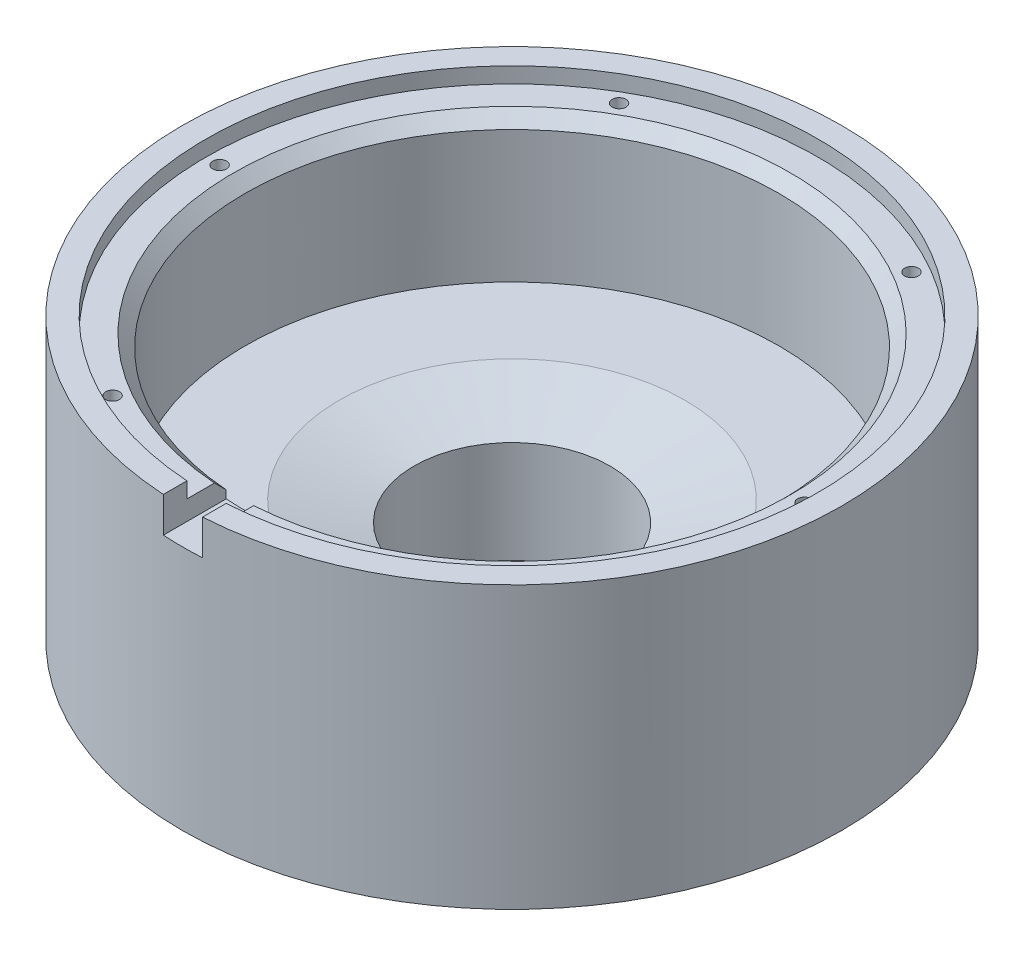
ISO-10303-21;
HEADER;
FILE_DESCRIPTION(('STEP AP214'),'2;1');
FILE_NAME('part.step','',(''),(''),'','','');
FILE_SCHEMA(('AUTOMOTIVE_DESIGN { 1 0 10303 214 1 1 1 1 }'));
ENDSEC;
DATA;
#1=APPLICATION_CONTEXT('core data for automotive mechanical design processes');
#2=APPLICATION_PROTOCOL_DEFINITION('international standard','automotive_design',2000,#1);
#3=PRODUCT_CONTEXT('',#1,'mechanical');
#4=PRODUCT('Part','Part','',(#3));
#5=PRODUCT_RELATED_PRODUCT_CATEGORY('part','',(#4));
#6=PRODUCT_DEFINITION_FORMATION('','',#4);
#7=PRODUCT_DEFINITION_CONTEXT('part definition',#1,'design');
#8=PRODUCT_DEFINITION('design','',#6,#7);
#9=PRODUCT_DEFINITION_SHAPE('','',#8);
#10=(LENGTH_UNIT() NAMED_UNIT(*) SI_UNIT(.MILLI.,.METRE.));
#11=(NAMED_UNIT(*) PLANE_ANGLE_UNIT() SI_UNIT($,.RADIAN.));
#12=(NAMED_UNIT(*) SI_UNIT($,.STERADIAN.) SOLID_ANGLE_UNIT());
#13=UNCERTAINTY_MEASURE_WITH_UNIT(LENGTH_MEASURE(1.E-05),#10,'distance_accuracy_value','');
#14=(GEOMETRIC_REPRESENTATION_CONTEXT(3) GLOBAL_UNCERTAINTY_ASSIGNED_CONTEXT((#13)) GLOBAL_UNIT_ASSIGNED_CONTEXT((#10,
#11,#12)) REPRESENTATION_CONTEXT('',''));
#15=CARTESIAN_POINT('',(0.,0.,0.));
#16=DIRECTION('',(0.,0.,1.));
#17=DIRECTION('',(1.,0.,0.));
#18=AXIS2_PLACEMENT_3D('',#15,#16,#17);
#19=CARTESIAN_POINT('',(0.,-30.2318711174091,0.));
#20=DIRECTION('',(0.,-1.,0.));
#21=DIRECTION('',(0.,0.,-1.));
#22=AXIS2_PLACEMENT_3D('',#19,#20,#21);
#23=CYLINDRICAL_SURFACE('',#22,42.0375);
#24=CARTESIAN_POINT('',(0.,-14.25,0.));
#25=DIRECTION('',(0.,-1.,0.));
#26=DIRECTION('',(0.,0.,-1.));
#27=AXIS2_PLACEMENT_3D('',#24,#25,#26);
#28=CIRCLE('',#27,42.0375);
#29=CARTESIAN_POINT('',(0.,-14.25,-42.0375));
#30=VERTEX_POINT('',#29);
#31=EDGE_CURVE('E181',#30,#30,#28,.T.);
#32=ORIENTED_EDGE('',*,*,#31,.F.);
#33=EDGE_LOOP('',(#32));
#34=FACE_BOUND('',#33,.T.);
#35=CARTESIAN_POINT('',(0.,21.59,0.));
#36=DIRECTION('',(0.,-1.,0.));
#37=DIRECTION('',(0.,0.,-1.));
#38=AXIS2_PLACEMENT_3D('',#35,#36,#37);
#39=CIRCLE('',#38,42.0375);
#40=CARTESIAN_POINT('',(-2.5,21.59,41.9630957658035));
#41=VERTEX_POINT('',#40);
#42=CARTESIAN_POINT('',(2.50000000000001,21.59,41.9630957658035));
#43=VERTEX_POINT('',#42);
#44=EDGE_CURVE('E123',#41,#43,#39,.T.);
#45=ORIENTED_EDGE('',*,*,#44,.T.);
#46=DIRECTION('',(0.,-1.,0.));
#47=VECTOR('',#46,1.);
#48=CARTESIAN_POINT('',(2.50000000000001,-30.2318711174091,41.9630957658035));
#49=LINE('',#48,#47);
#50=CARTESIAN_POINT('',(2.50000000000001,17.09,41.9630957658035));
#51=VERTEX_POINT('',#50);
#52=EDGE_CURVE('E184',#43,#51,#49,.T.);
#53=ORIENTED_EDGE('',*,*,#52,.T.);
#54=CARTESIAN_POINT('',(0.,17.09,0.));
#55=DIRECTION('',(0.,-1.,0.));
#56=DIRECTION('',(0.,0.,-1.));
#57=AXIS2_PLACEMENT_3D('',#54,#55,#56);
#58=CIRCLE('',#57,42.0375);
#59=CARTESIAN_POINT('',(-2.5,17.09,41.9630957658035));
#60=VERTEX_POINT('',#59);
#61=EDGE_CURVE('E112',#51,#60,#58,.T.);
#62=ORIENTED_EDGE('',*,*,#61,.T.);
#63=DIRECTION('',(0.,-1.,0.));
#64=VECTOR('',#63,1.);
#65=CARTESIAN_POINT('',(-2.5,-30.2318711174091,41.9630957658035));
#66=LINE('',#65,#64);
#67=EDGE_CURVE('E186',#60,#41,#66,.F.);
#68=ORIENTED_EDGE('',*,*,#67,.T.);
#69=EDGE_LOOP('',(#45,#53,#62,#68));
#70=FACE_BOUND('',#69,.T.);
#71=ADVANCED_FACE('F41',(#34,#70),#23,.T.);
#72=CARTESIAN_POINT('',(-42.0375,21.59,0.));
#73=DIRECTION('',(0.,-1.,0.));
#74=DIRECTION('',(0.,0.,-1.));
#75=AXIS2_PLACEMENT_3D('',#72,#73,#74);
#76=PLANE('',#75);
#77=CARTESIAN_POINT('',(0.,21.59,0.));
#78=DIRECTION('',(0.,-1.,0.));
#79=DIRECTION('',(0.,0.,-1.));
#80=AXIS2_PLACEMENT_3D('',#77,#78,#79);
#81=CIRCLE('',#80,39.0375);
#82=CARTESIAN_POINT('',(-2.5,21.59,38.9573665209803));
#83=VERTEX_POINT('',#82);
#84=CARTESIAN_POINT('',(2.5,21.59,38.9573665209803));
#85=VERTEX_POINT('',#84);
#86=EDGE_CURVE('E128',#83,#85,#81,.T.);
#87=ORIENTED_EDGE('',*,*,#86,.T.);
#88=DIRECTION('',(0.,0.,-1.));
#89=VECTOR('',#88,1.);
#90=CARTESIAN_POINT('',(2.50000000000001,21.59,42.0375));
#91=LINE('',#90,#89);
#92=EDGE_CURVE('E115',#43,#85,#91,.T.);
#93=ORIENTED_EDGE('',*,*,#92,.F.);
#94=ORIENTED_EDGE('',*,*,#44,.F.);
#95=DIRECTION('',(0.,0.,1.));
#96=VECTOR('',#95,1.);
#97=CARTESIAN_POINT('',(-2.5,21.59,42.0375));
#98=LINE('',#97,#96);
#99=EDGE_CURVE('E190',#83,#41,#98,.T.);
#100=ORIENTED_EDGE('',*,*,#99,.F.);
#101=EDGE_LOOP('',(#87,#93,#94,#100));
#102=FACE_BOUND('',#101,.T.);
#103=ADVANCED_FACE('F170',(#102),#76,.F.);
#104=CARTESIAN_POINT('',(0.,-30.2318711174091,0.));
#105=DIRECTION('',(0.,-1.,0.));
#106=DIRECTION('',(0.,0.,-1.));
#107=AXIS2_PLACEMENT_3D('',#104,#105,#106);
#108=CYLINDRICAL_SURFACE('',#107,39.0375);
#109=CARTESIAN_POINT('',(0.,19.59,0.));
#110=DIRECTION('',(0.,-1.,0.));
#111=DIRECTION('',(0.,0.,-1.));
#112=AXIS2_PLACEMENT_3D('',#109,#110,#111);
#113=CIRCLE('',#112,39.0375);
#114=CARTESIAN_POINT('',(-2.5,19.59,38.9573665209803));
#115=VERTEX_POINT('',#114);
#116=CARTESIAN_POINT('',(2.5,19.59,38.9573665209803));
#117=VERTEX_POINT('',#116);
#118=EDGE_CURVE('E230',#115,#117,#113,.T.);
#119=ORIENTED_EDGE('',*,*,#118,.T.);
#120=DIRECTION('',(0.,-1.,0.));
#121=VECTOR('',#120,1.);
#122=CARTESIAN_POINT('',(2.5,-30.2318711174091,38.9573665209803));
#123=LINE('',#122,#121);
#124=EDGE_CURVE('E213',#117,#85,#123,.F.);
#125=ORIENTED_EDGE('',*,*,#124,.T.);
#126=ORIENTED_EDGE('',*,*,#86,.F.);
#127=DIRECTION('',(0.,-1.,0.));
#128=VECTOR('',#127,1.);
#129=CARTESIAN_POINT('',(-2.5,-30.2318711174091,38.9573665209803));
#130=LINE('',#129,#128);
#131=EDGE_CURVE('E207',#83,#115,#130,.T.);
#132=ORIENTED_EDGE('',*,*,#131,.T.);
#133=EDGE_LOOP('',(#119,#125,#126,#132));
#134=FACE_BOUND('',#133,.T.);
#135=ADVANCED_FACE('F166',(#134),#108,.F.);
#136=CARTESIAN_POINT('',(-39.0375,19.59,0.));
#137=DIRECTION('',(0.,-1.,0.));
#138=DIRECTION('',(0.,0.,-1.));
#139=AXIS2_PLACEMENT_3D('',#136,#137,#138);
#140=PLANE('',#139);
#141=CARTESIAN_POINT('',(-37.2875,19.59,0.));
#142=DIRECTION('',(0.,1.,0.));
#143=DIRECTION('',(0.,0.,1.));
#144=AXIS2_PLACEMENT_3D('',#141,#142,#143);
#145=CIRCLE('',#144,0.874999999999998);
#146=CARTESIAN_POINT('',(-37.2875,19.59,0.874999999999996));
#147=VERTEX_POINT('',#146);
#148=EDGE_CURVE('E302',#147,#147,#145,.T.);
#149=ORIENTED_EDGE('',*,*,#148,.F.);
#150=EDGE_LOOP('',(#149));
#151=FACE_BOUND('',#150,.T.);
#152=CARTESIAN_POINT('',(-18.64375,19.59,32.2919222436123));
#153=DIRECTION('',(0.,1.,0.));
#154=DIRECTION('',(0.,0.,1.));
#155=AXIS2_PLACEMENT_3D('',#152,#153,#154);
#156=CIRCLE('',#155,0.875000000000002);
#157=CARTESIAN_POINT('',(-18.64375,19.59,33.1669222436123));
#158=VERTEX_POINT('',#157);
#159=EDGE_CURVE('E290',#158,#158,#156,.T.);
#160=ORIENTED_EDGE('',*,*,#159,.F.);
#161=EDGE_LOOP('',(#160));
#162=FACE_BOUND('',#161,.T.);
#163=CARTESIAN_POINT('',(18.64375,19.59,32.2919222436122));
#164=DIRECTION('',(0.,1.,0.));
#165=DIRECTION('',(0.,0.,1.));
#166=AXIS2_PLACEMENT_3D('',#163,#164,#165);
#167=CIRCLE('',#166,0.875000000000002);
#168=CARTESIAN_POINT('',(18.64375,19.59,33.1669222436122));
#169=VERTEX_POINT('',#168);
#170=EDGE_CURVE('E289',#169,#169,#167,.T.);
#171=ORIENTED_EDGE('',*,*,#170,.F.);
#172=EDGE_LOOP('',(#171));
#173=FACE_BOUND('',#172,.T.);
#174=CARTESIAN_POINT('',(37.2875,19.59,0.));
#175=DIRECTION('',(0.,1.,0.));
#176=DIRECTION('',(0.,0.,1.));
#177=AXIS2_PLACEMENT_3D('',#174,#175,#176);
#178=CIRCLE('',#177,0.874999999999998);
#179=CARTESIAN_POINT('',(37.2875,19.59,0.874999999999994));
#180=VERTEX_POINT('',#179);
#181=EDGE_CURVE('E317',#180,#180,#178,.T.);
#182=ORIENTED_EDGE('',*,*,#181,.F.);
#183=EDGE_LOOP('',(#182));
#184=FACE_BOUND('',#183,.T.);
#185=CARTESIAN_POINT('',(18.64375,19.59,-32.2919222436122));
#186=DIRECTION('',(0.,1.,0.));
#187=DIRECTION('',(0.,0.,1.));
#188=AXIS2_PLACEMENT_3D('',#185,#186,#187);
#189=CIRCLE('',#188,0.875000000000002);
#190=CARTESIAN_POINT('',(18.64375,19.59,-31.4169222436122));
#191=VERTEX_POINT('',#190);
#192=EDGE_CURVE('E311',#191,#191,#189,.T.);
#193=ORIENTED_EDGE('',*,*,#192,.F.);
#194=EDGE_LOOP('',(#193));
#195=FACE_BOUND('',#194,.T.);
#196=CARTESIAN_POINT('',(-18.64375,19.59,-32.2919222436122));
#197=DIRECTION('',(0.,1.,0.));
#198=DIRECTION('',(0.,0.,1.));
#199=AXIS2_PLACEMENT_3D('',#196,#197,#198);
#200=CIRCLE('',#199,0.875000000000002);
#201=CARTESIAN_POINT('',(-18.64375,19.59,-31.4169222436122));
#202=VERTEX_POINT('',#201);
#203=EDGE_CURVE('E305',#202,#202,#200,.T.);
#204=ORIENTED_EDGE('',*,*,#203,.F.);
#205=EDGE_LOOP('',(#204));
#206=FACE_BOUND('',#205,.T.);
#207=DIRECTION('',(0.,0.,-1.));
#208=VECTOR('',#207,1.);
#209=CARTESIAN_POINT('',(-2.5,19.59,0.));
#210=LINE('',#209,#208);
#211=CARTESIAN_POINT('',(-2.5,19.59,35.4494556552001));
#212=VERTEX_POINT('',#211);
#213=EDGE_CURVE('E202',#115,#212,#210,.T.);
#214=ORIENTED_EDGE('',*,*,#213,.T.);
#215=CARTESIAN_POINT('',(0.,19.59,0.));
#216=DIRECTION('',(0.,-1.,0.));
#217=DIRECTION('',(0.,0.,-1.));
#218=AXIS2_PLACEMENT_3D('',#215,#216,#217);
#219=CIRCLE('',#218,35.5375);
#220=CARTESIAN_POINT('',(2.5,19.59,35.4494556552001));
#221=VERTEX_POINT('',#220);
#222=EDGE_CURVE('E122',#212,#221,#219,.T.);
#223=ORIENTED_EDGE('',*,*,#222,.T.);
#224=DIRECTION('',(0.,0.,1.));
#225=VECTOR('',#224,1.);
#226=CARTESIAN_POINT('',(2.49999999999999,19.59,0.));
#227=LINE('',#226,#225);
#228=EDGE_CURVE('E211',#221,#117,#227,.T.);
#229=ORIENTED_EDGE('',*,*,#228,.T.);
#230=ORIENTED_EDGE('',*,*,#118,.F.);
#231=EDGE_LOOP('',(#214,#223,#229,#230));
#232=FACE_BOUND('',#231,.T.);
#233=ADVANCED_FACE('F163',(#151,#162,#173,#184,#195,#206,#232),#140,.F.);
#234=CARTESIAN_POINT('',(0.,-30.2318711174091,0.));
#235=DIRECTION('',(0.,-1.,0.));
#236=DIRECTION('',(0.,0.,-1.));
#237=AXIS2_PLACEMENT_3D('',#234,#235,#236);
#238=CYLINDRICAL_SURFACE('',#237,34.0375);
#239=DIRECTION('',(0.,1.,0.));
#240=VECTOR('',#239,1.);
#241=CARTESIAN_POINT('',(2.5,5.07793363447059,33.9455653399674));
#242=LINE('',#241,#240);
#243=CARTESIAN_POINT('',(2.5,17.09,33.9455653399674));
#244=VERTEX_POINT('',#243);
#245=CARTESIAN_POINT('',(2.5,18.09,33.9455653399674));
#246=VERTEX_POINT('',#245);
#247=EDGE_CURVE('E114',#244,#246,#242,.T.);
#248=ORIENTED_EDGE('',*,*,#247,.T.);
#249=CARTESIAN_POINT('',(0.,18.09,0.));
#250=DIRECTION('',(0.,-1.,0.));
#251=DIRECTION('',(0.,0.,-1.));
#252=AXIS2_PLACEMENT_3D('',#249,#250,#251);
#253=CIRCLE('',#252,34.0375);
#254=CARTESIAN_POINT('',(-2.5,18.09,33.9455653399674));
#255=VERTEX_POINT('',#254);
#256=EDGE_CURVE('E56',#246,#255,#253,.F.);
#257=ORIENTED_EDGE('',*,*,#256,.T.);
#258=DIRECTION('',(0.,1.,0.));
#259=VECTOR('',#258,1.);
#260=CARTESIAN_POINT('',(-2.5,5.07793363447059,33.9455653399674));
#261=LINE('',#260,#259);
#262=CARTESIAN_POINT('',(-2.5,17.09,33.9455653399675));
#263=VERTEX_POINT('',#262);
#264=EDGE_CURVE('E118',#263,#255,#261,.T.);
#265=ORIENTED_EDGE('',*,*,#264,.F.);
#266=CARTESIAN_POINT('',(0.,17.09,0.));
#267=DIRECTION('',(0.,-1.,0.));
#268=DIRECTION('',(0.,0.,-1.));
#269=AXIS2_PLACEMENT_3D('',#266,#267,#268);
#270=CIRCLE('',#269,34.0375);
#271=EDGE_CURVE('E111',#263,#244,#270,.F.);
#272=ORIENTED_EDGE('',*,*,#271,.T.);
#273=EDGE_LOOP('',(#248,#257,#265,#272));
#274=FACE_BOUND('',#273,.T.);
#275=CARTESIAN_POINT('',(0.,1.25,0.));
#276=DIRECTION('',(0.,-1.,0.));
#277=DIRECTION('',(0.,0.,-1.));
#278=AXIS2_PLACEMENT_3D('',#275,#276,#277);
#279=CIRCLE('',#278,34.0375);
#280=CARTESIAN_POINT('',(0.,1.25,-34.0375));
#281=VERTEX_POINT('',#280);
#282=EDGE_CURVE('E227',#281,#281,#279,.T.);
#283=ORIENTED_EDGE('',*,*,#282,.T.);
#284=EDGE_LOOP('',(#283));
#285=FACE_BOUND('',#284,.T.);
#286=ADVANCED_FACE('F120',(#274,#285),#238,.F.);
#287=CARTESIAN_POINT('',(-22.0375,1.25,0.));
#288=DIRECTION('',(0.,-1.,0.));
#289=DIRECTION('',(0.,0.,-1.));
#290=AXIS2_PLACEMENT_3D('',#287,#288,#289);
#291=PLANE('',#290);
#292=ORIENTED_EDGE('',*,*,#282,.F.);
#293=EDGE_LOOP('',(#292));
#294=FACE_BOUND('',#293,.T.);
#295=CARTESIAN_POINT('',(0.,1.25,0.));
#296=DIRECTION('',(0.,-1.,0.));
#297=DIRECTION('',(0.,0.,-1.));
#298=AXIS2_PLACEMENT_3D('',#295,#296,#297);
#299=CIRCLE('',#298,22.0375);
#300=CARTESIAN_POINT('',(0.,1.25,-22.0375));
#301=VERTEX_POINT('',#300);
#302=EDGE_CURVE('E224',#301,#301,#299,.T.);
#303=ORIENTED_EDGE('',*,*,#302,.T.);
#304=EDGE_LOOP('',(#303));
#305=FACE_BOUND('',#304,.T.);
#306=ADVANCED_FACE('F156',(#294,#305),#291,.F.);
#307=CARTESIAN_POINT('',(0.,-1.25,0.));
#308=DIRECTION('',(0.,1.,0.));
#309=DIRECTION('',(0.,0.,1.));
#310=AXIS2_PLACEMENT_3D('',#307,#308,#309);
#311=CONICAL_SURFACE('',#310,12.5,1.31444054079816);
#312=ORIENTED_EDGE('',*,*,#302,.F.);
#313=EDGE_LOOP('',(#312));
#314=FACE_BOUND('',#313,.T.);
#315=CARTESIAN_POINT('',(0.,-1.25,0.));
#316=DIRECTION('',(0.,-1.,0.));
#317=DIRECTION('',(0.,0.,-1.));
#318=AXIS2_PLACEMENT_3D('',#315,#316,#317);
#319=CIRCLE('',#318,12.5);
#320=CARTESIAN_POINT('',(0.,-1.25,-12.5));
#321=VERTEX_POINT('',#320);
#322=EDGE_CURVE('E221',#321,#321,#319,.T.);
#323=ORIENTED_EDGE('',*,*,#322,.T.);
#324=EDGE_LOOP('',(#323));
#325=FACE_BOUND('',#324,.T.);
#326=ADVANCED_FACE('F152',(#314,#325),#311,.F.);
#327=CARTESIAN_POINT('',(0.,-30.2318711174091,0.));
#328=DIRECTION('',(0.,-1.,0.));
#329=DIRECTION('',(0.,0.,-1.));
#330=AXIS2_PLACEMENT_3D('',#327,#328,#329);
#331=CYLINDRICAL_SURFACE('',#330,12.5);
#332=ORIENTED_EDGE('',*,*,#322,.F.);
#333=EDGE_LOOP('',(#332));
#334=FACE_BOUND('',#333,.T.);
#335=CARTESIAN_POINT('',(0.,-14.25,0.));
#336=DIRECTION('',(0.,-1.,0.));
#337=DIRECTION('',(0.,0.,-1.));
#338=AXIS2_PLACEMENT_3D('',#335,#336,#337);
#339=CIRCLE('',#338,12.5);
#340=CARTESIAN_POINT('',(0.,-14.25,-12.5));
#341=VERTEX_POINT('',#340);
#342=EDGE_CURVE('E218',#341,#341,#339,.T.);
#343=ORIENTED_EDGE('',*,*,#342,.T.);
#344=EDGE_LOOP('',(#343));
#345=FACE_BOUND('',#344,.T.);
#346=ADVANCED_FACE('F148',(#334,#345),#331,.F.);
#347=CARTESIAN_POINT('',(-12.5,-14.25,0.));
#348=DIRECTION('',(0.,1.,0.));
#349=DIRECTION('',(0.,0.,1.));
#350=AXIS2_PLACEMENT_3D('',#347,#348,#349);
#351=PLANE('',#350);
#352=CARTESIAN_POINT('',(-27.26875,-14.25,0.));
#353=DIRECTION('',(0.,-1.,0.));
#354=DIRECTION('',(0.,0.,-1.));
#355=AXIS2_PLACEMENT_3D('',#352,#353,#354);
#356=CIRCLE('',#355,2.87499999999999);
#357=CARTESIAN_POINT('',(-27.26875,-14.25,-2.87499999999999));
#358=VERTEX_POINT('',#357);
#359=EDGE_CURVE('E363',#358,#358,#356,.T.);
#360=ORIENTED_EDGE('',*,*,#359,.F.);
#361=EDGE_LOOP('',(#360));
#362=FACE_BOUND('',#361,.T.);
#363=CARTESIAN_POINT('',(-13.634375,-14.25,-23.6154302294469));
#364=DIRECTION('',(0.,-1.,0.));
#365=DIRECTION('',(0.,0.,-1.));
#366=AXIS2_PLACEMENT_3D('',#363,#364,#365);
#367=CIRCLE('',#366,2.875);
#368=CARTESIAN_POINT('',(-13.634375,-14.25,-26.4904302294469));
#369=VERTEX_POINT('',#368);
#370=EDGE_CURVE('E342',#369,#369,#367,.T.);
#371=ORIENTED_EDGE('',*,*,#370,.F.);
#372=EDGE_LOOP('',(#371));
#373=FACE_BOUND('',#372,.T.);
#374=CARTESIAN_POINT('',(13.634375,-14.25,-23.6154302294469));
#375=DIRECTION('',(0.,-1.,0.));
#376=DIRECTION('',(0.,0.,-1.));
#377=AXIS2_PLACEMENT_3D('',#374,#375,#376);
#378=CIRCLE('',#377,2.875);
#379=CARTESIAN_POINT('',(13.634375,-14.25,-26.4904302294469));
#380=VERTEX_POINT('',#379);
#381=EDGE_CURVE('E341',#380,#380,#378,.T.);
#382=ORIENTED_EDGE('',*,*,#381,.F.);
#383=EDGE_LOOP('',(#382));
#384=FACE_BOUND('',#383,.T.);
#385=CARTESIAN_POINT('',(27.26875,-14.25,0.));
#386=DIRECTION('',(0.,-1.,0.));
#387=DIRECTION('',(0.,0.,-1.));
#388=AXIS2_PLACEMENT_3D('',#385,#386,#387);
#389=CIRCLE('',#388,2.875);
#390=CARTESIAN_POINT('',(27.26875,-14.25,-2.875));
#391=VERTEX_POINT('',#390);
#392=EDGE_CURVE('E348',#391,#391,#389,.T.);
#393=ORIENTED_EDGE('',*,*,#392,.F.);
#394=EDGE_LOOP('',(#393));
#395=FACE_BOUND('',#394,.T.);
#396=CARTESIAN_POINT('',(13.634375,-14.25,23.6154302294469));
#397=DIRECTION('',(0.,-1.,0.));
#398=DIRECTION('',(0.,0.,-1.));
#399=AXIS2_PLACEMENT_3D('',#396,#397,#398);
#400=CIRCLE('',#399,2.875);
#401=CARTESIAN_POINT('',(13.634375,-14.25,20.7404302294469));
#402=VERTEX_POINT('',#401);
#403=EDGE_CURVE('E354',#402,#402,#400,.T.);
#404=ORIENTED_EDGE('',*,*,#403,.F.);
#405=EDGE_LOOP('',(#404));
#406=FACE_BOUND('',#405,.T.);
#407=CARTESIAN_POINT('',(-13.634375,-14.25,23.6154302294469));
#408=DIRECTION('',(0.,-1.,0.));
#409=DIRECTION('',(0.,0.,-1.));
#410=AXIS2_PLACEMENT_3D('',#407,#408,#409);
#411=CIRCLE('',#410,2.875);
#412=CARTESIAN_POINT('',(-13.634375,-14.25,20.7404302294469));
#413=VERTEX_POINT('',#412);
#414=EDGE_CURVE('E360',#413,#413,#411,.T.);
#415=ORIENTED_EDGE('',*,*,#414,.F.);
#416=EDGE_LOOP('',(#415));
#417=FACE_BOUND('',#416,.T.);
#418=ORIENTED_EDGE('',*,*,#342,.F.);
#419=EDGE_LOOP('',(#418));
#420=FACE_BOUND('',#419,.T.);
#421=ORIENTED_EDGE('',*,*,#31,.T.);
#422=EDGE_LOOP('',(#421));
#423=FACE_BOUND('',#422,.T.);
#424=ADVANCED_FACE('F145',(#362,#373,#384,#395,#406,#417,#420,#423),#351,.F.);
#425=CARTESIAN_POINT('',(-39.0375,17.09,0.));
#426=DIRECTION('',(0.,-1.,0.));
#427=DIRECTION('',(0.,0.,-1.));
#428=AXIS2_PLACEMENT_3D('',#425,#426,#427);
#429=PLANE('',#428);
#430=DIRECTION('',(0.,0.,-1.));
#431=VECTOR('',#430,1.);
#432=CARTESIAN_POINT('',(2.50000000000001,17.09,42.0375));
#433=LINE('',#432,#431);
#434=EDGE_CURVE('E107',#51,#244,#433,.T.);
#435=ORIENTED_EDGE('',*,*,#434,.T.);
#436=ORIENTED_EDGE('',*,*,#271,.F.);
#437=DIRECTION('',(0.,0.,1.));
#438=VECTOR('',#437,1.);
#439=CARTESIAN_POINT('',(-2.5,17.09,42.0375));
#440=LINE('',#439,#438);
#441=EDGE_CURVE('E201',#263,#60,#440,.T.);
#442=ORIENTED_EDGE('',*,*,#441,.T.);
#443=ORIENTED_EDGE('',*,*,#61,.F.);
#444=EDGE_LOOP('',(#435,#436,#442,#443));
#445=FACE_BOUND('',#444,.T.);
#446=ADVANCED_FACE('F108',(#445),#429,.F.);
#447=CARTESIAN_POINT('',(2.50000000000001,5.07793363447059,42.0375));
#448=DIRECTION('',(1.,0.,0.));
#449=DIRECTION('',(0.,0.,-1.));
#450=AXIS2_PLACEMENT_3D('',#447,#448,#449);
#451=PLANE('',#450);
#452=ORIENTED_EDGE('',*,*,#228,.F.);
#453=CARTESIAN_POINT('',(2.5,19.59,35.4494556552001));
#454=CARTESIAN_POINT('',(2.5,19.3399859667675,35.1988212662673));
#455=CARTESIAN_POINT('',(2.5,19.0899789501534,34.9481798788669));
#456=CARTESIAN_POINT('',(2.5,18.5899789501534,34.4468831071227));
#457=CARTESIAN_POINT('',(2.5,18.3399859667675,34.1962277227788));
#458=CARTESIAN_POINT('',(2.5,18.09,33.9455653399674));
#459=B_SPLINE_CURVE_WITH_KNOTS('',3,(#453,#454,#455,#456,#457,#458),.UNSPECIFIED.,.F.,.F.,(4,2,
4),(0.,1.06203649697572,2.12407299398732),.UNSPECIFIED.);
#460=EDGE_CURVE('E70',#221,#246,#459,.T.);
#461=ORIENTED_EDGE('',*,*,#460,.T.);
#462=ORIENTED_EDGE('',*,*,#247,.F.);
#463=ORIENTED_EDGE('',*,*,#434,.F.);
#464=ORIENTED_EDGE('',*,*,#52,.F.);
#465=ORIENTED_EDGE('',*,*,#92,.T.);
#466=ORIENTED_EDGE('',*,*,#124,.F.);
#467=EDGE_LOOP('',(#452,#461,#462,#463,#464,#465,#466));
#468=FACE_BOUND('',#467,.T.);
#469=ADVANCED_FACE('F117',(#468),#451,.F.);
#470=CARTESIAN_POINT('',(-2.5,5.07793363447059,42.0375));
#471=DIRECTION('',(-1.,0.,0.));
#472=DIRECTION('',(0.,0.,1.));
#473=AXIS2_PLACEMENT_3D('',#470,#471,#472);
#474=PLANE('',#473);
#475=ORIENTED_EDGE('',*,*,#264,.T.);
#476=CARTESIAN_POINT('',(-2.5,18.09,33.9455653399674));
#477=CARTESIAN_POINT('',(-2.5,18.3399859667675,34.1962277227788));
#478=CARTESIAN_POINT('',(-2.5,18.5899789501534,34.4468831071227));
#479=CARTESIAN_POINT('',(-2.5,19.0899789501534,34.9481798788669));
#480=CARTESIAN_POINT('',(-2.5,19.3399859667675,35.1988212662673));
#481=CARTESIAN_POINT('',(-2.5,19.59,35.4494556552001));
#482=B_SPLINE_CURVE_WITH_KNOTS('',3,(#476,#477,#478,#479,#480,#481),.UNSPECIFIED.,.F.,.F.,(4,2,
4),(0.,1.0620364970116,2.12407299398732),.UNSPECIFIED.);
#483=EDGE_CURVE('E12',#255,#212,#482,.T.);
#484=ORIENTED_EDGE('',*,*,#483,.T.);
#485=ORIENTED_EDGE('',*,*,#213,.F.);
#486=ORIENTED_EDGE('',*,*,#131,.F.);
#487=ORIENTED_EDGE('',*,*,#99,.T.);
#488=ORIENTED_EDGE('',*,*,#67,.F.);
#489=ORIENTED_EDGE('',*,*,#441,.F.);
#490=EDGE_LOOP('',(#475,#484,#485,#486,#487,#488,#489));
#491=FACE_BOUND('',#490,.T.);
#492=ADVANCED_FACE('F140',(#491),#474,.F.);
#493=CARTESIAN_POINT('',(0.,19.59,0.));
#494=DIRECTION('',(0.,1.,0.));
#495=DIRECTION('',(0.,0.,1.));
#496=AXIS2_PLACEMENT_3D('',#493,#494,#495);
#497=CONICAL_SURFACE('',#496,35.5375,0.785398163397448);
#498=ORIENTED_EDGE('',*,*,#483,.F.);
#499=ORIENTED_EDGE('',*,*,#256,.F.);
#500=ORIENTED_EDGE('',*,*,#460,.F.);
#501=ORIENTED_EDGE('',*,*,#222,.F.);
#502=EDGE_LOOP('',(#498,#499,#500,#501));
#503=FACE_BOUND('',#502,.T.);
#504=ADVANCED_FACE('F44',(#503),#497,.F.);
#505=CARTESIAN_POINT('',(-18.64375,13.59,-32.2919222436122));
#506=DIRECTION('',(0.,1.,0.));
#507=DIRECTION('',(0.,0.,1.));
#508=AXIS2_PLACEMENT_3D('',#505,#506,#507);
#509=CYLINDRICAL_SURFACE('',#508,0.875000000000002);
#510=CARTESIAN_POINT('',(-18.64375,13.59,-32.2919222436122));
#511=DIRECTION('',(0.,1.,0.));
#512=DIRECTION('',(0.,0.,1.));
#513=AXIS2_PLACEMENT_3D('',#510,#511,#512);
#514=CIRCLE('',#513,0.875000000000002);
#515=CARTESIAN_POINT('',(-18.64375,13.59,-31.4169222436122));
#516=VERTEX_POINT('',#515);
#517=EDGE_CURVE('E308',#516,#516,#514,.T.);
#518=ORIENTED_EDGE('',*,*,#517,.F.);
#519=EDGE_LOOP('',(#518));
#520=FACE_BOUND('',#519,.T.);
#521=ORIENTED_EDGE('',*,*,#203,.T.);
#522=EDGE_LOOP('',(#521));
#523=FACE_BOUND('',#522,.T.);
#524=ADVANCED_FACE('F242',(#520,#523),#509,.F.);
#525=CARTESIAN_POINT('',(-18.64375,13.59,-32.2919222436122));
#526=DIRECTION('',(0.,1.,0.));
#527=DIRECTION('',(0.,0.,1.));
#528=AXIS2_PLACEMENT_3D('',#525,#526,#527);
#529=PLANE('',#528);
#530=ORIENTED_EDGE('',*,*,#517,.T.);
#531=EDGE_LOOP('',(#530));
#532=FACE_BOUND('',#531,.T.);
#533=ADVANCED_FACE('F246',(#532),#529,.T.);
#534=CARTESIAN_POINT('',(18.64375,13.59,-32.2919222436122));
#535=DIRECTION('',(0.,1.,0.));
#536=DIRECTION('',(0.,0.,1.));
#537=AXIS2_PLACEMENT_3D('',#534,#535,#536);
#538=CYLINDRICAL_SURFACE('',#537,0.875000000000002);
#539=CARTESIAN_POINT('',(18.64375,13.59,-32.2919222436122));
#540=DIRECTION('',(0.,1.,0.));
#541=DIRECTION('',(0.,0.,1.));
#542=AXIS2_PLACEMENT_3D('',#539,#540,#541);
#543=CIRCLE('',#542,0.875000000000002);
#544=CARTESIAN_POINT('',(18.64375,13.59,-31.4169222436122));
#545=VERTEX_POINT('',#544);
#546=EDGE_CURVE('E314',#545,#545,#543,.T.);
#547=ORIENTED_EDGE('',*,*,#546,.F.);
#548=EDGE_LOOP('',(#547));
#549=FACE_BOUND('',#548,.T.);
#550=ORIENTED_EDGE('',*,*,#192,.T.);
#551=EDGE_LOOP('',(#550));
#552=FACE_BOUND('',#551,.T.);
#553=ADVANCED_FACE('F252',(#549,#552),#538,.F.);
#554=CARTESIAN_POINT('',(18.64375,13.59,-32.2919222436122));
#555=DIRECTION('',(0.,1.,0.));
#556=DIRECTION('',(0.,0.,1.));
#557=AXIS2_PLACEMENT_3D('',#554,#555,#556);
#558=PLANE('',#557);
#559=ORIENTED_EDGE('',*,*,#546,.T.);
#560=EDGE_LOOP('',(#559));
#561=FACE_BOUND('',#560,.T.);
#562=ADVANCED_FACE('F263',(#561),#558,.T.);
#563=CARTESIAN_POINT('',(37.2875,13.59,0.));
#564=DIRECTION('',(0.,1.,0.));
#565=DIRECTION('',(0.,0.,1.));
#566=AXIS2_PLACEMENT_3D('',#563,#564,#565);
#567=CYLINDRICAL_SURFACE('',#566,0.874999999999998);
#568=CARTESIAN_POINT('',(37.2875,13.59,0.));
#569=DIRECTION('',(0.,1.,0.));
#570=DIRECTION('',(0.,0.,1.));
#571=AXIS2_PLACEMENT_3D('',#568,#569,#570);
#572=CIRCLE('',#571,0.874999999999998);
#573=CARTESIAN_POINT('',(37.2875,13.59,0.874999999999994));
#574=VERTEX_POINT('',#573);
#575=EDGE_CURVE('E292',#574,#574,#572,.T.);
#576=ORIENTED_EDGE('',*,*,#575,.F.);
#577=EDGE_LOOP('',(#576));
#578=FACE_BOUND('',#577,.T.);
#579=ORIENTED_EDGE('',*,*,#181,.T.);
#580=EDGE_LOOP('',(#579));
#581=FACE_BOUND('',#580,.T.);
#582=ADVANCED_FACE('F267',(#578,#581),#567,.F.);
#583=CARTESIAN_POINT('',(37.2875,13.59,0.));
#584=DIRECTION('',(0.,1.,0.));
#585=DIRECTION('',(0.,0.,1.));
#586=AXIS2_PLACEMENT_3D('',#583,#584,#585);
#587=PLANE('',#586);
#588=ORIENTED_EDGE('',*,*,#575,.T.);
#589=EDGE_LOOP('',(#588));
#590=FACE_BOUND('',#589,.T.);
#591=ADVANCED_FACE('F271',(#590),#587,.T.);
#592=CARTESIAN_POINT('',(18.64375,13.59,32.2919222436122));
#593=DIRECTION('',(0.,1.,0.));
#594=DIRECTION('',(0.,0.,1.));
#595=AXIS2_PLACEMENT_3D('',#592,#593,#594);
#596=CYLINDRICAL_SURFACE('',#595,0.875000000000002);
#597=CARTESIAN_POINT('',(18.64375,13.59,32.2919222436122));
#598=DIRECTION('',(0.,1.,0.));
#599=DIRECTION('',(0.,0.,1.));
#600=AXIS2_PLACEMENT_3D('',#597,#598,#599);
#601=CIRCLE('',#600,0.875000000000002);
#602=CARTESIAN_POINT('',(18.64375,13.59,33.1669222436122));
#603=VERTEX_POINT('',#602);
#604=EDGE_CURVE('E198',#603,#603,#601,.T.);
#605=ORIENTED_EDGE('',*,*,#604,.F.);
#606=EDGE_LOOP('',(#605));
#607=FACE_BOUND('',#606,.T.);
#608=ORIENTED_EDGE('',*,*,#170,.T.);
#609=EDGE_LOOP('',(#608));
#610=FACE_BOUND('',#609,.T.);
#611=ADVANCED_FACE('F275',(#607,#610),#596,.F.);
#612=CARTESIAN_POINT('',(18.64375,13.59,32.2919222436122));
#613=DIRECTION('',(0.,1.,0.));
#614=DIRECTION('',(0.,0.,1.));
#615=AXIS2_PLACEMENT_3D('',#612,#613,#614);
#616=PLANE('',#615);
#617=ORIENTED_EDGE('',*,*,#604,.T.);
#618=EDGE_LOOP('',(#617));
#619=FACE_BOUND('',#618,.T.);
#620=ADVANCED_FACE('F278',(#619),#616,.T.);
#621=CARTESIAN_POINT('',(-18.64375,13.59,32.2919222436123));
#622=DIRECTION('',(0.,1.,0.));
#623=DIRECTION('',(0.,0.,1.));
#624=AXIS2_PLACEMENT_3D('',#621,#622,#623);
#625=CYLINDRICAL_SURFACE('',#624,0.875000000000002);
#626=CARTESIAN_POINT('',(-18.64375,13.59,32.2919222436123));
#627=DIRECTION('',(0.,1.,0.));
#628=DIRECTION('',(0.,0.,1.));
#629=AXIS2_PLACEMENT_3D('',#626,#627,#628);
#630=CIRCLE('',#629,0.875000000000002);
#631=CARTESIAN_POINT('',(-18.64375,13.59,33.1669222436123));
#632=VERTEX_POINT('',#631);
#633=EDGE_CURVE('E294',#632,#632,#630,.T.);
#634=ORIENTED_EDGE('',*,*,#633,.F.);
#635=EDGE_LOOP('',(#634));
#636=FACE_BOUND('',#635,.T.);
#637=ORIENTED_EDGE('',*,*,#159,.T.);
#638=EDGE_LOOP('',(#637));
#639=FACE_BOUND('',#638,.T.);
#640=ADVANCED_FACE('F281',(#636,#639),#625,.F.);
#641=CARTESIAN_POINT('',(-18.64375,13.59,32.2919222436123));
#642=DIRECTION('',(0.,1.,0.));
#643=DIRECTION('',(0.,0.,1.));
#644=AXIS2_PLACEMENT_3D('',#641,#642,#643);
#645=PLANE('',#644);
#646=ORIENTED_EDGE('',*,*,#633,.T.);
#647=EDGE_LOOP('',(#646));
#648=FACE_BOUND('',#647,.T.);
#649=ADVANCED_FACE('F258',(#648),#645,.T.);
#650=CARTESIAN_POINT('',(-37.2875,13.59,0.));
#651=DIRECTION('',(0.,1.,0.));
#652=DIRECTION('',(0.,0.,1.));
#653=AXIS2_PLACEMENT_3D('',#650,#651,#652);
#654=CYLINDRICAL_SURFACE('',#653,0.874999999999998);
#655=CARTESIAN_POINT('',(-37.2875,13.59,0.));
#656=DIRECTION('',(0.,1.,0.));
#657=DIRECTION('',(0.,0.,1.));
#658=AXIS2_PLACEMENT_3D('',#655,#656,#657);
#659=CIRCLE('',#658,0.874999999999998);
#660=CARTESIAN_POINT('',(-37.2875,13.59,0.874999999999996));
#661=VERTEX_POINT('',#660);
#662=EDGE_CURVE('E195',#661,#661,#659,.T.);
#663=ORIENTED_EDGE('',*,*,#662,.F.);
#664=EDGE_LOOP('',(#663));
#665=FACE_BOUND('',#664,.T.);
#666=ORIENTED_EDGE('',*,*,#148,.T.);
#667=EDGE_LOOP('',(#666));
#668=FACE_BOUND('',#667,.T.);
#669=ADVANCED_FACE('F410',(#665,#668),#654,.F.);
#670=CARTESIAN_POINT('',(-37.2875,13.59,0.));
#671=DIRECTION('',(0.,1.,0.));
#672=DIRECTION('',(0.,0.,1.));
#673=AXIS2_PLACEMENT_3D('',#670,#671,#672);
#674=PLANE('',#673);
#675=ORIENTED_EDGE('',*,*,#662,.T.);
#676=EDGE_LOOP('',(#675));
#677=FACE_BOUND('',#676,.T.);
#678=ADVANCED_FACE('F400',(#677),#674,.T.);
#679=CARTESIAN_POINT('',(-13.634375,-6.25,23.6154302294469));
#680=DIRECTION('',(0.,-1.,0.));
#681=DIRECTION('',(0.,0.,-1.));
#682=AXIS2_PLACEMENT_3D('',#679,#680,#681);
#683=CYLINDRICAL_SURFACE('',#682,2.875);
#684=CARTESIAN_POINT('',(-13.634375,-6.25,23.6154302294469));
#685=DIRECTION('',(0.,-1.,0.));
#686=DIRECTION('',(0.,0.,-1.));
#687=AXIS2_PLACEMENT_3D('',#684,#685,#686);
#688=CIRCLE('',#687,2.875);
#689=CARTESIAN_POINT('',(-13.634375,-6.25,20.7404302294469));
#690=VERTEX_POINT('',#689);
#691=EDGE_CURVE('E357',#690,#690,#688,.T.);
#692=ORIENTED_EDGE('',*,*,#691,.F.);
#693=EDGE_LOOP('',(#692));
#694=FACE_BOUND('',#693,.T.);
#695=ORIENTED_EDGE('',*,*,#414,.T.);
#696=EDGE_LOOP('',(#695));
#697=FACE_BOUND('',#696,.T.);
#698=ADVANCED_FACE('F397',(#694,#697),#683,.F.);
#699=CARTESIAN_POINT('',(-13.634375,-6.25,23.6154302294469));
#700=DIRECTION('',(0.,-1.,0.));
#701=DIRECTION('',(0.,0.,-1.));
#702=AXIS2_PLACEMENT_3D('',#699,#700,#701);
#703=PLANE('',#702);
#704=ORIENTED_EDGE('',*,*,#691,.T.);
#705=EDGE_LOOP('',(#704));
#706=FACE_BOUND('',#705,.T.);
#707=ADVANCED_FACE('F399',(#706),#703,.T.);
#708=CARTESIAN_POINT('',(13.634375,-6.25,23.6154302294469));
#709=DIRECTION('',(0.,-1.,0.));
#710=DIRECTION('',(0.,0.,-1.));
#711=AXIS2_PLACEMENT_3D('',#708,#709,#710);
#712=CYLINDRICAL_SURFACE('',#711,2.875);
#713=CARTESIAN_POINT('',(13.634375,-6.25,23.6154302294469));
#714=DIRECTION('',(0.,-1.,0.));
#715=DIRECTION('',(0.,0.,-1.));
#716=AXIS2_PLACEMENT_3D('',#713,#714,#715);
#717=CIRCLE('',#716,2.875);
#718=CARTESIAN_POINT('',(13.634375,-6.25,20.7404302294469));
#719=VERTEX_POINT('',#718);
#720=EDGE_CURVE('E351',#719,#719,#717,.T.);
#721=ORIENTED_EDGE('',*,*,#720,.F.);
#722=EDGE_LOOP('',(#721));
#723=FACE_BOUND('',#722,.T.);
#724=ORIENTED_EDGE('',*,*,#403,.T.);
#725=EDGE_LOOP('',(#724));
#726=FACE_BOUND('',#725,.T.);
#727=ADVANCED_FACE('F407',(#723,#726),#712,.F.);
#728=CARTESIAN_POINT('',(13.634375,-6.25,23.6154302294469));
#729=DIRECTION('',(0.,-1.,0.));
#730=DIRECTION('',(0.,0.,-1.));
#731=AXIS2_PLACEMENT_3D('',#728,#729,#730);
#732=PLANE('',#731);
#733=ORIENTED_EDGE('',*,*,#720,.T.);
#734=EDGE_LOOP('',(#733));
#735=FACE_BOUND('',#734,.T.);
#736=ADVANCED_FACE('F418',(#735),#732,.T.);
#737=CARTESIAN_POINT('',(27.26875,-6.25,0.));
#738=DIRECTION('',(0.,-1.,0.));
#739=DIRECTION('',(0.,0.,-1.));
#740=AXIS2_PLACEMENT_3D('',#737,#738,#739);
#741=CYLINDRICAL_SURFACE('',#740,2.875);
#742=CARTESIAN_POINT('',(27.26875,-6.25,0.));
#743=DIRECTION('',(0.,-1.,0.));
#744=DIRECTION('',(0.,0.,-1.));
#745=AXIS2_PLACEMENT_3D('',#742,#743,#744);
#746=CIRCLE('',#745,2.875);
#747=CARTESIAN_POINT('',(27.26875,-6.25,-2.875));
#748=VERTEX_POINT('',#747);
#749=EDGE_CURVE('E345',#748,#748,#746,.T.);
#750=ORIENTED_EDGE('',*,*,#749,.F.);
#751=EDGE_LOOP('',(#750));
#752=FACE_BOUND('',#751,.T.);
#753=ORIENTED_EDGE('',*,*,#392,.T.);
#754=EDGE_LOOP('',(#753));
#755=FACE_BOUND('',#754,.T.);
#756=ADVANCED_FACE('F422',(#752,#755),#741,.F.);
#757=CARTESIAN_POINT('',(27.26875,-6.25,0.));
#758=DIRECTION('',(0.,-1.,0.));
#759=DIRECTION('',(0.,0.,-1.));
#760=AXIS2_PLACEMENT_3D('',#757,#758,#759);
#761=PLANE('',#760);
#762=ORIENTED_EDGE('',*,*,#749,.T.);
#763=EDGE_LOOP('',(#762));
#764=FACE_BOUND('',#763,.T.);
#765=ADVANCED_FACE('F426',(#764),#761,.T.);
#766=CARTESIAN_POINT('',(13.634375,-6.25,-23.6154302294469));
#767=DIRECTION('',(0.,-1.,0.));
#768=DIRECTION('',(0.,0.,-1.));
#769=AXIS2_PLACEMENT_3D('',#766,#767,#768);
#770=CYLINDRICAL_SURFACE('',#769,2.875);
#771=CARTESIAN_POINT('',(13.634375,-6.25,-23.6154302294469));
#772=DIRECTION('',(0.,-1.,0.));
#773=DIRECTION('',(0.,0.,-1.));
#774=AXIS2_PLACEMENT_3D('',#771,#772,#773);
#775=CIRCLE('',#774,2.875);
#776=CARTESIAN_POINT('',(13.634375,-6.25,-26.4904302294469));
#777=VERTEX_POINT('',#776);
#778=EDGE_CURVE('E338',#777,#777,#775,.T.);
#779=ORIENTED_EDGE('',*,*,#778,.F.);
#780=EDGE_LOOP('',(#779));
#781=FACE_BOUND('',#780,.T.);
#782=ORIENTED_EDGE('',*,*,#381,.T.);
#783=EDGE_LOOP('',(#782));
#784=FACE_BOUND('',#783,.T.);
#785=ADVANCED_FACE('F430',(#781,#784),#770,.F.);
#786=CARTESIAN_POINT('',(13.634375,-6.25,-23.6154302294469));
#787=DIRECTION('',(0.,-1.,0.));
#788=DIRECTION('',(0.,0.,-1.));
#789=AXIS2_PLACEMENT_3D('',#786,#787,#788);
#790=PLANE('',#789);
#791=ORIENTED_EDGE('',*,*,#778,.T.);
#792=EDGE_LOOP('',(#791));
#793=FACE_BOUND('',#792,.T.);
#794=ADVANCED_FACE('F434',(#793),#790,.T.);
#795=CARTESIAN_POINT('',(-13.634375,-6.25,-23.6154302294469));
#796=DIRECTION('',(0.,-1.,0.));
#797=DIRECTION('',(0.,0.,-1.));
#798=AXIS2_PLACEMENT_3D('',#795,#796,#797);
#799=CYLINDRICAL_SURFACE('',#798,2.875);
#800=CARTESIAN_POINT('',(-13.634375,-6.25,-23.6154302294469));
#801=DIRECTION('',(0.,-1.,0.));
#802=DIRECTION('',(0.,0.,-1.));
#803=AXIS2_PLACEMENT_3D('',#800,#801,#802);
#804=CIRCLE('',#803,2.875);
#805=CARTESIAN_POINT('',(-13.634375,-6.25,-26.4904302294469));
#806=VERTEX_POINT('',#805);
#807=EDGE_CURVE('E364',#806,#806,#804,.T.);
#808=ORIENTED_EDGE('',*,*,#807,.F.);
#809=EDGE_LOOP('',(#808));
#810=FACE_BOUND('',#809,.T.);
#811=ORIENTED_EDGE('',*,*,#370,.T.);
#812=EDGE_LOOP('',(#811));
#813=FACE_BOUND('',#812,.T.);
#814=ADVANCED_FACE('F437',(#810,#813),#799,.F.);
#815=CARTESIAN_POINT('',(-13.634375,-6.25,-23.6154302294469));
#816=DIRECTION('',(0.,-1.,0.));
#817=DIRECTION('',(0.,0.,-1.));
#818=AXIS2_PLACEMENT_3D('',#815,#816,#817);
#819=PLANE('',#818);
#820=ORIENTED_EDGE('',*,*,#807,.T.);
#821=EDGE_LOOP('',(#820));
#822=FACE_BOUND('',#821,.T.);
#823=ADVANCED_FACE('F379',(#822),#819,.T.);
#824=CARTESIAN_POINT('',(-27.26875,-6.25,0.));
#825=DIRECTION('',(0.,-1.,0.));
#826=DIRECTION('',(0.,0.,-1.));
#827=AXIS2_PLACEMENT_3D('',#824,#825,#826);
#828=CYLINDRICAL_SURFACE('',#827,2.87499999999999);
#829=CARTESIAN_POINT('',(-27.26875,-6.25,0.));
#830=DIRECTION('',(0.,-1.,0.));
#831=DIRECTION('',(0.,0.,-1.));
#832=AXIS2_PLACEMENT_3D('',#829,#830,#831);
#833=CIRCLE('',#832,2.87499999999999);
#834=CARTESIAN_POINT('',(-27.26875,-6.25,-2.87499999999999));
#835=VERTEX_POINT('',#834);
#836=EDGE_CURVE('E299',#835,#835,#833,.T.);
#837=ORIENTED_EDGE('',*,*,#836,.F.);
#838=EDGE_LOOP('',(#837));
#839=FACE_BOUND('',#838,.T.);
#840=ORIENTED_EDGE('',*,*,#359,.T.);
#841=EDGE_LOOP('',(#840));
#842=FACE_BOUND('',#841,.T.);
#843=ADVANCED_FACE('F376',(#839,#842),#828,.F.);
#844=CARTESIAN_POINT('',(-27.26875,-6.25,0.));
#845=DIRECTION('',(0.,-1.,0.));
#846=DIRECTION('',(0.,0.,-1.));
#847=AXIS2_PLACEMENT_3D('',#844,#845,#846);
#848=PLANE('',#847);
#849=ORIENTED_EDGE('',*,*,#836,.T.);
#850=EDGE_LOOP('',(#849));
#851=FACE_BOUND('',#850,.T.);
#852=ADVANCED_FACE('F374',(#851),#848,.T.);
#853=CLOSED_SHELL('',(#71,#103,#135,#233,#286,#306,#326,#346,#424,#446,#469,#492,#504,#524,#533,
#553,#562,#582,#591,#611,#620,#640,#649,#669,#678,#698,#707,#727,#736,#756,#765,#785,#794,#814,
#823,#843,#852));
#854=MANIFOLD_SOLID_BREP('B2',#853);
#855=ADVANCED_BREP_SHAPE_REPRESENTATION('',(#18,#854),#14);
#856=SHAPE_DEFINITION_REPRESENTATION(#9,#855);
ENDSEC;
END-ISO-10303-21;
